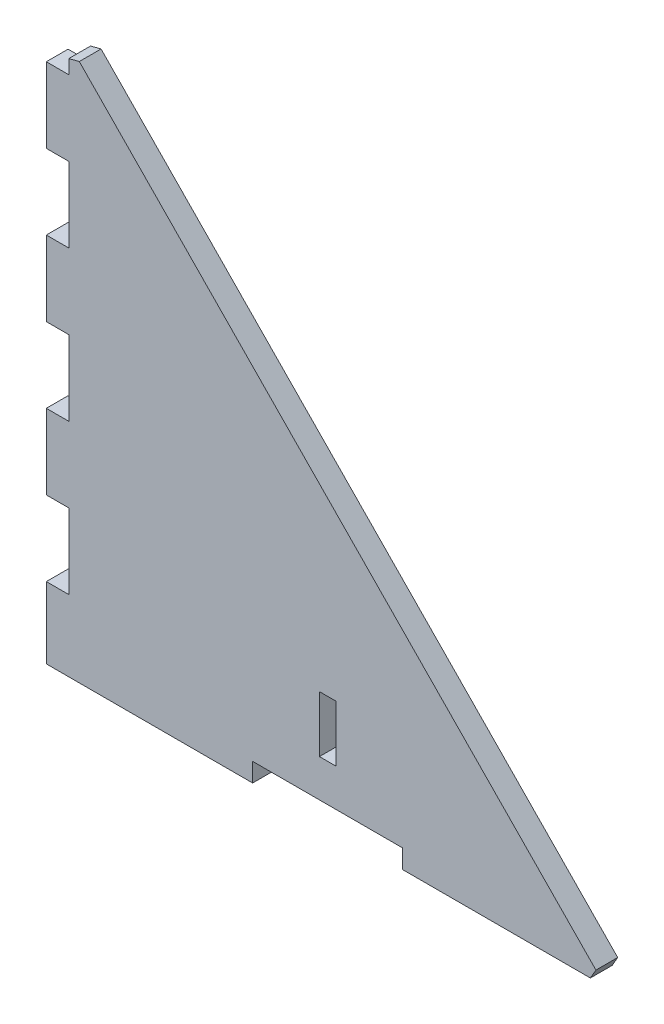
ISO-10303-21;
HEADER;
FILE_DESCRIPTION(('STEP AP214'),'2;1');
FILE_NAME('part.step','',(''),(''),'','','');
FILE_SCHEMA(('AUTOMOTIVE_DESIGN { 1 0 10303 214 1 1 1 1 }'));
ENDSEC;
DATA;
#1=APPLICATION_CONTEXT('core data for automotive mechanical design processes');
#2=APPLICATION_PROTOCOL_DEFINITION('international standard','automotive_design',2000,#1);
#3=PRODUCT_CONTEXT('',#1,'mechanical');
#4=PRODUCT('Part','Part','',(#3));
#5=PRODUCT_RELATED_PRODUCT_CATEGORY('part','',(#4));
#6=PRODUCT_DEFINITION_FORMATION('','',#4);
#7=PRODUCT_DEFINITION_CONTEXT('part definition',#1,'design');
#8=PRODUCT_DEFINITION('design','',#6,#7);
#9=PRODUCT_DEFINITION_SHAPE('','',#8);
#10=(LENGTH_UNIT() NAMED_UNIT(*) SI_UNIT(.MILLI.,.METRE.));
#11=(NAMED_UNIT(*) PLANE_ANGLE_UNIT() SI_UNIT($,.RADIAN.));
#12=(NAMED_UNIT(*) SI_UNIT($,.STERADIAN.) SOLID_ANGLE_UNIT());
#13=UNCERTAINTY_MEASURE_WITH_UNIT(LENGTH_MEASURE(1.E-05),#10,'distance_accuracy_value','');
#14=(GEOMETRIC_REPRESENTATION_CONTEXT(3) GLOBAL_UNCERTAINTY_ASSIGNED_CONTEXT((#13)) GLOBAL_UNIT_ASSIGNED_CONTEXT((#10,
#11,#12)) REPRESENTATION_CONTEXT('',''));
#15=CARTESIAN_POINT('',(0.,0.,0.));
#16=DIRECTION('',(0.,0.,1.));
#17=DIRECTION('',(1.,0.,0.));
#18=AXIS2_PLACEMENT_3D('',#15,#16,#17);
#19=CARTESIAN_POINT('',(0.,0.,84.8143550510485));
#20=DIRECTION('',(0.,0.,1.));
#21=DIRECTION('',(-1.,0.,0.));
#22=AXIS2_PLACEMENT_3D('',#19,#20,#21);
#23=PLANE('',#22);
#24=DIRECTION('',(0.699031413700107,-0.715090961109445,0.));
#25=VECTOR('',#24,1.);
#26=CARTESIAN_POINT('',(5.99999999999928,73.6541279702322,84.8143550510485));
#27=LINE('',#26,#25);
#28=CARTESIAN_POINT('',(7.39806282739952,72.2239460480133,84.8143550510485));
#29=VERTEX_POINT('',#28);
#30=CARTESIAN_POINT('',(76.2538531899955,1.78626278609469,84.8143550510485));
#31=VERTEX_POINT('',#30);
#32=EDGE_CURVE('E316',#29,#31,#27,.T.);
#33=ORIENTED_EDGE('',*,*,#32,.F.);
#34=DIRECTION('',(0.968802645187463,0.247833481752919,0.));
#35=VECTOR('',#34,1.);
#36=CARTESIAN_POINT('',(-16.8866949550152,66.011559960259,84.8143550510485));
#37=LINE('',#36,#35);
#38=CARTESIAN_POINT('',(5.99999999999921,71.8663017125595,84.8143550510485));
#39=VERTEX_POINT('',#38);
#40=EDGE_CURVE('E47',#29,#39,#37,.F.);
#41=ORIENTED_EDGE('',*,*,#40,.T.);
#42=DIRECTION('',(0.,1.,0.));
#43=VECTOR('',#42,1.);
#44=CARTESIAN_POINT('',(5.99999999999913,69.9999999999999,84.8143550510485));
#45=LINE('',#44,#43);
#46=CARTESIAN_POINT('',(5.99999999999913,69.9999999999999,84.8143550510485));
#47=VERTEX_POINT('',#46);
#48=EDGE_CURVE('E313',#47,#39,#45,.T.);
#49=ORIENTED_EDGE('',*,*,#48,.F.);
#50=DIRECTION('',(1.,0.,0.));
#51=VECTOR('',#50,1.);
#52=CARTESIAN_POINT('',(5.99999999999913,69.9999999999999,84.8143550510485));
#53=LINE('',#52,#51);
#54=CARTESIAN_POINT('',(2.99999999999914,69.9999999999999,84.8143550510485));
#55=VERTEX_POINT('',#54);
#56=EDGE_CURVE('E310',#55,#47,#53,.T.);
#57=ORIENTED_EDGE('',*,*,#56,.F.);
#58=DIRECTION('',(0.,1.,0.));
#59=VECTOR('',#58,1.);
#60=CARTESIAN_POINT('',(2.99999999999914,59.9999999999999,84.8143550510485));
#61=LINE('',#60,#59);
#62=CARTESIAN_POINT('',(2.99999999999914,59.9999999999999,84.8143550510485));
#63=VERTEX_POINT('',#62);
#64=EDGE_CURVE('E307',#63,#55,#61,.T.);
#65=ORIENTED_EDGE('',*,*,#64,.F.);
#66=DIRECTION('',(-1.,0.,0.));
#67=VECTOR('',#66,1.);
#68=CARTESIAN_POINT('',(5.99999999999913,59.9999999999999,84.8143550510485));
#69=LINE('',#68,#67);
#70=CARTESIAN_POINT('',(5.99999999999913,59.9999999999999,84.8143550510485));
#71=VERTEX_POINT('',#70);
#72=EDGE_CURVE('E304',#71,#63,#69,.T.);
#73=ORIENTED_EDGE('',*,*,#72,.F.);
#74=DIRECTION('',(0.,1.,0.));
#75=VECTOR('',#74,1.);
#76=CARTESIAN_POINT('',(5.99999999999913,49.9999999999999,84.8143550510485));
#77=LINE('',#76,#75);
#78=CARTESIAN_POINT('',(5.99999999999913,49.9999999999999,84.8143550510485));
#79=VERTEX_POINT('',#78);
#80=EDGE_CURVE('E301',#79,#71,#77,.T.);
#81=ORIENTED_EDGE('',*,*,#80,.F.);
#82=DIRECTION('',(1.,0.,0.));
#83=VECTOR('',#82,1.);
#84=CARTESIAN_POINT('',(5.99999999999913,49.9999999999999,84.8143550510485));
#85=LINE('',#84,#83);
#86=CARTESIAN_POINT('',(2.99999999999914,49.9999999999999,84.8143550510485));
#87=VERTEX_POINT('',#86);
#88=EDGE_CURVE('E298',#87,#79,#85,.T.);
#89=ORIENTED_EDGE('',*,*,#88,.F.);
#90=DIRECTION('',(0.,1.,0.));
#91=VECTOR('',#90,1.);
#92=CARTESIAN_POINT('',(2.99999999999914,39.9999999999999,84.8143550510485));
#93=LINE('',#92,#91);
#94=CARTESIAN_POINT('',(2.99999999999914,39.9999999999999,84.8143550510485));
#95=VERTEX_POINT('',#94);
#96=EDGE_CURVE('E295',#95,#87,#93,.T.);
#97=ORIENTED_EDGE('',*,*,#96,.F.);
#98=DIRECTION('',(-1.,0.,0.));
#99=VECTOR('',#98,1.);
#100=CARTESIAN_POINT('',(5.99999999999913,39.9999999999999,84.8143550510485));
#101=LINE('',#100,#99);
#102=CARTESIAN_POINT('',(5.99999999999913,39.9999999999999,84.8143550510485));
#103=VERTEX_POINT('',#102);
#104=EDGE_CURVE('E292',#103,#95,#101,.T.);
#105=ORIENTED_EDGE('',*,*,#104,.F.);
#106=DIRECTION('',(0.,1.,0.));
#107=VECTOR('',#106,1.);
#108=CARTESIAN_POINT('',(5.99999999999913,29.9999999999999,84.8143550510485));
#109=LINE('',#108,#107);
#110=CARTESIAN_POINT('',(5.99999999999913,29.9999999999999,84.8143550510485));
#111=VERTEX_POINT('',#110);
#112=EDGE_CURVE('E289',#111,#103,#109,.T.);
#113=ORIENTED_EDGE('',*,*,#112,.F.);
#114=DIRECTION('',(1.,0.,0.));
#115=VECTOR('',#114,1.);
#116=CARTESIAN_POINT('',(5.99999999999913,29.9999999999999,84.8143550510485));
#117=LINE('',#116,#115);
#118=CARTESIAN_POINT('',(2.99999999999913,29.9999999999998,84.8143550510485));
#119=VERTEX_POINT('',#118);
#120=EDGE_CURVE('E286',#119,#111,#117,.T.);
#121=ORIENTED_EDGE('',*,*,#120,.F.);
#122=DIRECTION('',(0.,1.,0.));
#123=VECTOR('',#122,1.);
#124=CARTESIAN_POINT('',(2.99999999999913,19.9999999999999,84.8143550510485));
#125=LINE('',#124,#123);
#126=CARTESIAN_POINT('',(2.99999999999913,19.9999999999999,84.8143550510485));
#127=VERTEX_POINT('',#126);
#128=EDGE_CURVE('E283',#127,#119,#125,.T.);
#129=ORIENTED_EDGE('',*,*,#128,.F.);
#130=DIRECTION('',(-1.,0.,0.));
#131=VECTOR('',#130,1.);
#132=CARTESIAN_POINT('',(5.99999999999927,19.9999999999998,84.8143550510485));
#133=LINE('',#132,#131);
#134=CARTESIAN_POINT('',(5.99999999999927,19.9999999999998,84.8143550510485));
#135=VERTEX_POINT('',#134);
#136=EDGE_CURVE('E280',#135,#127,#133,.T.);
#137=ORIENTED_EDGE('',*,*,#136,.F.);
#138=DIRECTION('',(0.,1.,0.));
#139=VECTOR('',#138,1.);
#140=CARTESIAN_POINT('',(5.9999999999992,9.99999999999984,84.8143550510485));
#141=LINE('',#140,#139);
#142=CARTESIAN_POINT('',(5.9999999999992,9.99999999999984,84.8143550510485));
#143=VERTEX_POINT('',#142);
#144=EDGE_CURVE('E277',#143,#135,#141,.T.);
#145=ORIENTED_EDGE('',*,*,#144,.F.);
#146=DIRECTION('',(1.,0.,0.));
#147=VECTOR('',#146,1.);
#148=CARTESIAN_POINT('',(5.9999999999992,9.99999999999984,84.8143550510485));
#149=LINE('',#148,#147);
#150=CARTESIAN_POINT('',(2.99999999999913,9.99999999999986,84.8143550510485));
#151=VERTEX_POINT('',#150);
#152=EDGE_CURVE('E274',#151,#143,#149,.T.);
#153=ORIENTED_EDGE('',*,*,#152,.F.);
#154=DIRECTION('',(0.,1.,0.));
#155=VECTOR('',#154,1.);
#156=CARTESIAN_POINT('',(2.99999999999912,0.,84.8143550510485));
#157=LINE('',#156,#155);
#158=CARTESIAN_POINT('',(2.99999999999913,0.5,84.8143550510485));
#159=VERTEX_POINT('',#158);
#160=EDGE_CURVE('E271',#159,#151,#157,.T.);
#161=ORIENTED_EDGE('',*,*,#160,.F.);
#162=DIRECTION('',(-1.,0.,0.));
#163=VECTOR('',#162,1.);
#164=CARTESIAN_POINT('',(0.,0.5,84.8143550510485));
#165=LINE('',#164,#163);
#166=CARTESIAN_POINT('',(30.4999999999991,0.5,84.8143550510485));
#167=VERTEX_POINT('',#166);
#168=EDGE_CURVE('E270',#167,#159,#165,.T.);
#169=ORIENTED_EDGE('',*,*,#168,.F.);
#170=DIRECTION('',(0.,-1.,0.));
#171=VECTOR('',#170,1.);
#172=CARTESIAN_POINT('',(30.4999999999991,0.,84.8143550510485));
#173=LINE('',#172,#171);
#174=CARTESIAN_POINT('',(30.4999999999991,3.,84.8143550510485));
#175=VERTEX_POINT('',#174);
#176=EDGE_CURVE('E267',#175,#167,#173,.T.);
#177=ORIENTED_EDGE('',*,*,#176,.F.);
#178=DIRECTION('',(-1.,0.,0.));
#179=VECTOR('',#178,1.);
#180=CARTESIAN_POINT('',(30.4999999999991,3.,84.8143550510485));
#181=LINE('',#180,#179);
#182=CARTESIAN_POINT('',(50.4999999999991,3.,84.8143550510485));
#183=VERTEX_POINT('',#182);
#184=EDGE_CURVE('E263',#183,#175,#181,.T.);
#185=ORIENTED_EDGE('',*,*,#184,.F.);
#186=DIRECTION('',(0.,1.,0.));
#187=VECTOR('',#186,1.);
#188=CARTESIAN_POINT('',(50.4999999999991,0.,84.8143550510485));
#189=LINE('',#188,#187);
#190=CARTESIAN_POINT('',(50.4999999999991,0.499999999999998,84.8143550510485));
#191=VERTEX_POINT('',#190);
#192=EDGE_CURVE('E260',#191,#183,#189,.T.);
#193=ORIENTED_EDGE('',*,*,#192,.F.);
#194=DIRECTION('',(-1.,0.,0.));
#195=VECTOR('',#194,1.);
#196=CARTESIAN_POINT('',(0.,0.500000000000004,84.8143550510485));
#197=LINE('',#196,#195);
#198=CARTESIAN_POINT('',(75.5112290241952,0.499999999999995,84.8143550510485));
#199=VERTEX_POINT('',#198);
#200=EDGE_CURVE('E264',#199,#191,#197,.T.);
#201=ORIENTED_EDGE('',*,*,#200,.F.);
#202=DIRECTION('',(-0.499999999999994,-0.866025403784442,0.));
#203=VECTOR('',#202,1.);
#204=CARTESIAN_POINT('',(56.4169154172007,-32.5723213029687,84.8143550510485));
#205=LINE('',#204,#203);
#206=EDGE_CURVE('E59',#199,#31,#205,.F.);
#207=ORIENTED_EDGE('',*,*,#206,.T.);
#208=EDGE_LOOP('',(#33,#41,#49,#57,#65,#73,#81,#89,#97,#105,#113,#121,#129,#137,#145,#153,#161,
#169,#177,#185,#193,#201,#207));
#209=FACE_BOUND('',#208,.T.);
#210=DIRECTION('',(0.,1.,0.));
#211=VECTOR('',#210,1.);
#212=CARTESIAN_POINT('',(39.3999999999991,8.,84.8143550510485));
#213=LINE('',#212,#211);
#214=CARTESIAN_POINT('',(39.3999999999991,8.,84.8143550510485));
#215=VERTEX_POINT('',#214);
#216=CARTESIAN_POINT('',(39.3999999999991,15.5,84.8143550510485));
#217=VERTEX_POINT('',#216);
#218=EDGE_CURVE('E235',#215,#217,#213,.T.);
#219=ORIENTED_EDGE('',*,*,#218,.T.);
#220=DIRECTION('',(1.,0.,0.));
#221=VECTOR('',#220,1.);
#222=CARTESIAN_POINT('',(39.3999999999991,15.5,84.8143550510485));
#223=LINE('',#222,#221);
#224=CARTESIAN_POINT('',(41.5999999999991,15.5,84.8143550510485));
#225=VERTEX_POINT('',#224);
#226=EDGE_CURVE('E242',#217,#225,#223,.T.);
#227=ORIENTED_EDGE('',*,*,#226,.T.);
#228=DIRECTION('',(0.,-1.,0.));
#229=VECTOR('',#228,1.);
#230=CARTESIAN_POINT('',(41.5999999999991,8.,84.8143550510485));
#231=LINE('',#230,#229);
#232=CARTESIAN_POINT('',(41.5999999999991,8.,84.8143550510485));
#233=VERTEX_POINT('',#232);
#234=EDGE_CURVE('E237',#225,#233,#231,.T.);
#235=ORIENTED_EDGE('',*,*,#234,.T.);
#236=DIRECTION('',(-1.,0.,0.));
#237=VECTOR('',#236,1.);
#238=CARTESIAN_POINT('',(39.3999999999991,8.,84.8143550510485));
#239=LINE('',#238,#237);
#240=EDGE_CURVE('E221',#233,#215,#239,.T.);
#241=ORIENTED_EDGE('',*,*,#240,.T.);
#242=EDGE_LOOP('',(#219,#227,#235,#241));
#243=FACE_BOUND('',#242,.T.);
#244=ADVANCED_FACE('F38',(#209,#243),#23,.T.);
#245=CARTESIAN_POINT('',(0.,0.,81.9143550510485));
#246=DIRECTION('',(0.,0.,1.));
#247=DIRECTION('',(-1.,0.,0.));
#248=AXIS2_PLACEMENT_3D('',#245,#246,#247);
#249=PLANE('',#248);
#250=DIRECTION('',(0.,1.,0.));
#251=VECTOR('',#250,1.);
#252=CARTESIAN_POINT('',(5.99999999999913,69.9999999999999,81.9143550510485));
#253=LINE('',#252,#251);
#254=CARTESIAN_POINT('',(5.99999999999913,69.9999999999999,81.9143550510485));
#255=VERTEX_POINT('',#254);
#256=CARTESIAN_POINT('',(5.99999999999921,71.8663017125595,81.9143550510485));
#257=VERTEX_POINT('',#256);
#258=EDGE_CURVE('E371',#255,#257,#253,.T.);
#259=ORIENTED_EDGE('',*,*,#258,.T.);
#260=DIRECTION('',(-0.968802645187463,-0.247833481752919,0.));
#261=VECTOR('',#260,1.);
#262=CARTESIAN_POINT('',(5.99999999999921,71.8663017125595,81.9143550510485));
#263=LINE('',#262,#261);
#264=CARTESIAN_POINT('',(7.39806282739951,72.2239460480133,81.9143550510485));
#265=VERTEX_POINT('',#264);
#266=EDGE_CURVE('E426',#257,#265,#263,.F.);
#267=ORIENTED_EDGE('',*,*,#266,.T.);
#268=DIRECTION('',(0.699031413700107,-0.715090961109445,0.));
#269=VECTOR('',#268,1.);
#270=CARTESIAN_POINT('',(5.99999999999928,73.6541279702322,81.9143550510485));
#271=LINE('',#270,#269);
#272=CARTESIAN_POINT('',(76.2538531899955,1.78626278609469,81.9143550510485));
#273=VERTEX_POINT('',#272);
#274=EDGE_CURVE('E374',#265,#273,#271,.T.);
#275=ORIENTED_EDGE('',*,*,#274,.T.);
#276=DIRECTION('',(0.499999999999994,0.866025403784442,0.));
#277=VECTOR('',#276,1.);
#278=CARTESIAN_POINT('',(76.2538531899955,1.78626278609469,81.9143550510485));
#279=LINE('',#278,#277);
#280=CARTESIAN_POINT('',(75.5112290241952,0.499999999999995,81.9143550510485));
#281=VERTEX_POINT('',#280);
#282=EDGE_CURVE('E424',#273,#281,#279,.F.);
#283=ORIENTED_EDGE('',*,*,#282,.T.);
#284=DIRECTION('',(-1.,0.,0.));
#285=VECTOR('',#284,1.);
#286=CARTESIAN_POINT('',(0.,0.500000000000004,81.9143550510485));
#287=LINE('',#286,#285);
#288=CARTESIAN_POINT('',(50.4999999999991,0.499999999999998,81.9143550510485));
#289=VERTEX_POINT('',#288);
#290=EDGE_CURVE('E229',#281,#289,#287,.T.);
#291=ORIENTED_EDGE('',*,*,#290,.T.);
#292=DIRECTION('',(0.,1.,0.));
#293=VECTOR('',#292,1.);
#294=CARTESIAN_POINT('',(50.4999999999991,0.,81.9143550510485));
#295=LINE('',#294,#293);
#296=CARTESIAN_POINT('',(50.4999999999991,3.,81.9143550510485));
#297=VERTEX_POINT('',#296);
#298=EDGE_CURVE('E319',#289,#297,#295,.T.);
#299=ORIENTED_EDGE('',*,*,#298,.T.);
#300=DIRECTION('',(-1.,0.,0.));
#301=VECTOR('',#300,1.);
#302=CARTESIAN_POINT('',(30.4999999999991,3.,81.9143550510485));
#303=LINE('',#302,#301);
#304=CARTESIAN_POINT('',(30.4999999999991,3.,81.9143550510485));
#305=VERTEX_POINT('',#304);
#306=EDGE_CURVE('E322',#297,#305,#303,.T.);
#307=ORIENTED_EDGE('',*,*,#306,.T.);
#308=DIRECTION('',(0.,-1.,0.));
#309=VECTOR('',#308,1.);
#310=CARTESIAN_POINT('',(30.4999999999991,0.,81.9143550510485));
#311=LINE('',#310,#309);
#312=CARTESIAN_POINT('',(30.4999999999991,0.5,81.9143550510485));
#313=VERTEX_POINT('',#312);
#314=EDGE_CURVE('E325',#305,#313,#311,.T.);
#315=ORIENTED_EDGE('',*,*,#314,.T.);
#316=DIRECTION('',(-1.,0.,0.));
#317=VECTOR('',#316,1.);
#318=CARTESIAN_POINT('',(0.,0.5,81.9143550510485));
#319=LINE('',#318,#317);
#320=CARTESIAN_POINT('',(2.99999999999912,0.5,81.9143550510485));
#321=VERTEX_POINT('',#320);
#322=EDGE_CURVE('E328',#313,#321,#319,.T.);
#323=ORIENTED_EDGE('',*,*,#322,.T.);
#324=DIRECTION('',(0.,1.,0.));
#325=VECTOR('',#324,1.);
#326=CARTESIAN_POINT('',(2.99999999999912,0.,81.9143550510485));
#327=LINE('',#326,#325);
#328=CARTESIAN_POINT('',(2.99999999999913,9.99999999999986,81.9143550510485));
#329=VERTEX_POINT('',#328);
#330=EDGE_CURVE('E329',#321,#329,#327,.T.);
#331=ORIENTED_EDGE('',*,*,#330,.T.);
#332=DIRECTION('',(1.,0.,0.));
#333=VECTOR('',#332,1.);
#334=CARTESIAN_POINT('',(5.9999999999992,9.99999999999984,81.9143550510485));
#335=LINE('',#334,#333);
#336=CARTESIAN_POINT('',(5.9999999999992,9.99999999999984,81.9143550510485));
#337=VERTEX_POINT('',#336);
#338=EDGE_CURVE('E332',#329,#337,#335,.T.);
#339=ORIENTED_EDGE('',*,*,#338,.T.);
#340=DIRECTION('',(0.,1.,0.));
#341=VECTOR('',#340,1.);
#342=CARTESIAN_POINT('',(5.9999999999992,9.99999999999984,81.9143550510485));
#343=LINE('',#342,#341);
#344=CARTESIAN_POINT('',(5.99999999999927,19.9999999999998,81.9143550510485));
#345=VERTEX_POINT('',#344);
#346=EDGE_CURVE('E335',#337,#345,#343,.T.);
#347=ORIENTED_EDGE('',*,*,#346,.T.);
#348=DIRECTION('',(-1.,0.,0.));
#349=VECTOR('',#348,1.);
#350=CARTESIAN_POINT('',(5.99999999999927,19.9999999999998,81.9143550510485));
#351=LINE('',#350,#349);
#352=CARTESIAN_POINT('',(2.99999999999913,19.9999999999999,81.9143550510485));
#353=VERTEX_POINT('',#352);
#354=EDGE_CURVE('E338',#345,#353,#351,.T.);
#355=ORIENTED_EDGE('',*,*,#354,.T.);
#356=DIRECTION('',(0.,1.,0.));
#357=VECTOR('',#356,1.);
#358=CARTESIAN_POINT('',(2.99999999999913,19.9999999999999,81.9143550510485));
#359=LINE('',#358,#357);
#360=CARTESIAN_POINT('',(2.99999999999913,29.9999999999998,81.9143550510485));
#361=VERTEX_POINT('',#360);
#362=EDGE_CURVE('E341',#353,#361,#359,.T.);
#363=ORIENTED_EDGE('',*,*,#362,.T.);
#364=DIRECTION('',(1.,0.,0.));
#365=VECTOR('',#364,1.);
#366=CARTESIAN_POINT('',(5.99999999999913,29.9999999999999,81.9143550510485));
#367=LINE('',#366,#365);
#368=CARTESIAN_POINT('',(5.99999999999913,29.9999999999999,81.9143550510485));
#369=VERTEX_POINT('',#368);
#370=EDGE_CURVE('E344',#361,#369,#367,.T.);
#371=ORIENTED_EDGE('',*,*,#370,.T.);
#372=DIRECTION('',(0.,1.,0.));
#373=VECTOR('',#372,1.);
#374=CARTESIAN_POINT('',(5.99999999999913,29.9999999999999,81.9143550510485));
#375=LINE('',#374,#373);
#376=CARTESIAN_POINT('',(5.99999999999913,39.9999999999999,81.9143550510485));
#377=VERTEX_POINT('',#376);
#378=EDGE_CURVE('E347',#369,#377,#375,.T.);
#379=ORIENTED_EDGE('',*,*,#378,.T.);
#380=DIRECTION('',(-1.,0.,0.));
#381=VECTOR('',#380,1.);
#382=CARTESIAN_POINT('',(5.99999999999913,39.9999999999999,81.9143550510485));
#383=LINE('',#382,#381);
#384=CARTESIAN_POINT('',(2.99999999999913,39.9999999999999,81.9143550510485));
#385=VERTEX_POINT('',#384);
#386=EDGE_CURVE('E350',#377,#385,#383,.T.);
#387=ORIENTED_EDGE('',*,*,#386,.T.);
#388=DIRECTION('',(0.,1.,0.));
#389=VECTOR('',#388,1.);
#390=CARTESIAN_POINT('',(2.99999999999913,39.9999999999999,81.9143550510485));
#391=LINE('',#390,#389);
#392=CARTESIAN_POINT('',(2.99999999999914,49.9999999999999,81.9143550510485));
#393=VERTEX_POINT('',#392);
#394=EDGE_CURVE('E353',#385,#393,#391,.T.);
#395=ORIENTED_EDGE('',*,*,#394,.T.);
#396=DIRECTION('',(1.,0.,0.));
#397=VECTOR('',#396,1.);
#398=CARTESIAN_POINT('',(5.99999999999913,49.9999999999999,81.9143550510485));
#399=LINE('',#398,#397);
#400=CARTESIAN_POINT('',(5.99999999999913,49.9999999999999,81.9143550510485));
#401=VERTEX_POINT('',#400);
#402=EDGE_CURVE('E356',#393,#401,#399,.T.);
#403=ORIENTED_EDGE('',*,*,#402,.T.);
#404=DIRECTION('',(0.,1.,0.));
#405=VECTOR('',#404,1.);
#406=CARTESIAN_POINT('',(5.99999999999913,49.9999999999999,81.9143550510485));
#407=LINE('',#406,#405);
#408=CARTESIAN_POINT('',(5.99999999999913,59.9999999999999,81.9143550510485));
#409=VERTEX_POINT('',#408);
#410=EDGE_CURVE('E359',#401,#409,#407,.T.);
#411=ORIENTED_EDGE('',*,*,#410,.T.);
#412=DIRECTION('',(-1.,0.,0.));
#413=VECTOR('',#412,1.);
#414=CARTESIAN_POINT('',(5.99999999999913,59.9999999999999,81.9143550510485));
#415=LINE('',#414,#413);
#416=CARTESIAN_POINT('',(2.99999999999914,59.9999999999999,81.9143550510485));
#417=VERTEX_POINT('',#416);
#418=EDGE_CURVE('E362',#409,#417,#415,.T.);
#419=ORIENTED_EDGE('',*,*,#418,.T.);
#420=DIRECTION('',(0.,1.,0.));
#421=VECTOR('',#420,1.);
#422=CARTESIAN_POINT('',(2.99999999999914,59.9999999999999,81.9143550510485));
#423=LINE('',#422,#421);
#424=CARTESIAN_POINT('',(2.99999999999914,69.9999999999999,81.9143550510485));
#425=VERTEX_POINT('',#424);
#426=EDGE_CURVE('E365',#417,#425,#423,.T.);
#427=ORIENTED_EDGE('',*,*,#426,.T.);
#428=DIRECTION('',(1.,0.,0.));
#429=VECTOR('',#428,1.);
#430=CARTESIAN_POINT('',(5.99999999999913,69.9999999999999,81.9143550510485));
#431=LINE('',#430,#429);
#432=EDGE_CURVE('E368',#425,#255,#431,.T.);
#433=ORIENTED_EDGE('',*,*,#432,.T.);
#434=EDGE_LOOP('',(#259,#267,#275,#283,#291,#299,#307,#315,#323,#331,#339,#347,#355,#363,#371,
#379,#387,#395,#403,#411,#419,#427,#433));
#435=FACE_BOUND('',#434,.T.);
#436=DIRECTION('',(-1.,0.,0.));
#437=VECTOR('',#436,1.);
#438=CARTESIAN_POINT('',(39.3999999999991,8.,81.9143550510485));
#439=LINE('',#438,#437);
#440=CARTESIAN_POINT('',(41.5999999999991,8.,81.9143550510485));
#441=VERTEX_POINT('',#440);
#442=CARTESIAN_POINT('',(39.3999999999991,8.,81.9143550510485));
#443=VERTEX_POINT('',#442);
#444=EDGE_CURVE('E224',#441,#443,#439,.T.);
#445=ORIENTED_EDGE('',*,*,#444,.F.);
#446=DIRECTION('',(0.,-1.,0.));
#447=VECTOR('',#446,1.);
#448=CARTESIAN_POINT('',(41.5999999999991,8.,81.9143550510485));
#449=LINE('',#448,#447);
#450=CARTESIAN_POINT('',(41.5999999999991,15.5,81.9143550510485));
#451=VERTEX_POINT('',#450);
#452=EDGE_CURVE('E238',#451,#441,#449,.T.);
#453=ORIENTED_EDGE('',*,*,#452,.F.);
#454=DIRECTION('',(1.,0.,0.));
#455=VECTOR('',#454,1.);
#456=CARTESIAN_POINT('',(39.3999999999991,15.5,81.9143550510485));
#457=LINE('',#456,#455);
#458=CARTESIAN_POINT('',(39.3999999999991,15.5,81.9143550510485));
#459=VERTEX_POINT('',#458);
#460=EDGE_CURVE('E251',#459,#451,#457,.T.);
#461=ORIENTED_EDGE('',*,*,#460,.F.);
#462=DIRECTION('',(0.,1.,0.));
#463=VECTOR('',#462,1.);
#464=CARTESIAN_POINT('',(39.3999999999991,8.,81.9143550510485));
#465=LINE('',#464,#463);
#466=EDGE_CURVE('E249',#443,#459,#465,.T.);
#467=ORIENTED_EDGE('',*,*,#466,.F.);
#468=EDGE_LOOP('',(#445,#453,#461,#467));
#469=FACE_BOUND('',#468,.T.);
#470=ADVANCED_FACE('F445',(#435,#469),#249,.F.);
#471=CARTESIAN_POINT('',(77.9999999999991,0.499999999999994,84.8143550510485));
#472=DIRECTION('',(0.,1.,0.));
#473=DIRECTION('',(-1.,0.,0.));
#474=AXIS2_PLACEMENT_3D('',#471,#472,#473);
#475=PLANE('',#474);
#476=ORIENTED_EDGE('',*,*,#290,.F.);
#477=DIRECTION('',(0.,0.,1.));
#478=VECTOR('',#477,1.);
#479=CARTESIAN_POINT('',(75.5112290241952,0.499999999999995,84.8143550510485));
#480=LINE('',#479,#478);
#481=EDGE_CURVE('E12',#281,#199,#480,.T.);
#482=ORIENTED_EDGE('',*,*,#481,.T.);
#483=ORIENTED_EDGE('',*,*,#200,.T.);
#484=DIRECTION('',(0.,0.,-1.));
#485=VECTOR('',#484,1.);
#486=CARTESIAN_POINT('',(50.4999999999991,0.499999999999998,84.8143550510485));
#487=LINE('',#486,#485);
#488=EDGE_CURVE('E410',#191,#289,#487,.T.);
#489=ORIENTED_EDGE('',*,*,#488,.T.);
#490=EDGE_LOOP('',(#476,#482,#483,#489));
#491=FACE_BOUND('',#490,.T.);
#492=ADVANCED_FACE('F451',(#491),#475,.F.);
#493=CARTESIAN_POINT('',(50.4999999999991,0.,84.8143550510485));
#494=DIRECTION('',(1.,0.,0.));
#495=DIRECTION('',(0.,0.,1.));
#496=AXIS2_PLACEMENT_3D('',#493,#494,#495);
#497=PLANE('',#496);
#498=ORIENTED_EDGE('',*,*,#298,.F.);
#499=ORIENTED_EDGE('',*,*,#488,.F.);
#500=ORIENTED_EDGE('',*,*,#192,.T.);
#501=DIRECTION('',(0.,0.,-1.));
#502=VECTOR('',#501,1.);
#503=CARTESIAN_POINT('',(50.4999999999991,3.,84.8143550510485));
#504=LINE('',#503,#502);
#505=EDGE_CURVE('E407',#183,#297,#504,.T.);
#506=ORIENTED_EDGE('',*,*,#505,.T.);
#507=EDGE_LOOP('',(#498,#499,#500,#506));
#508=FACE_BOUND('',#507,.T.);
#509=ADVANCED_FACE('F456',(#508),#497,.F.);
#510=CARTESIAN_POINT('',(30.4999999999991,3.,84.8143550510485));
#511=DIRECTION('',(0.,1.,0.));
#512=DIRECTION('',(-1.,0.,0.));
#513=AXIS2_PLACEMENT_3D('',#510,#511,#512);
#514=PLANE('',#513);
#515=ORIENTED_EDGE('',*,*,#306,.F.);
#516=ORIENTED_EDGE('',*,*,#505,.F.);
#517=ORIENTED_EDGE('',*,*,#184,.T.);
#518=DIRECTION('',(0.,0.,-1.));
#519=VECTOR('',#518,1.);
#520=CARTESIAN_POINT('',(30.4999999999991,3.,84.8143550510485));
#521=LINE('',#520,#519);
#522=EDGE_CURVE('E405',#175,#305,#521,.T.);
#523=ORIENTED_EDGE('',*,*,#522,.T.);
#524=EDGE_LOOP('',(#515,#516,#517,#523));
#525=FACE_BOUND('',#524,.T.);
#526=ADVANCED_FACE('F460',(#525),#514,.F.);
#527=CARTESIAN_POINT('',(30.4999999999991,0.,84.8143550510485));
#528=DIRECTION('',(-1.,0.,0.));
#529=DIRECTION('',(0.,-1.,0.));
#530=AXIS2_PLACEMENT_3D('',#527,#528,#529);
#531=PLANE('',#530);
#532=ORIENTED_EDGE('',*,*,#314,.F.);
#533=ORIENTED_EDGE('',*,*,#522,.F.);
#534=ORIENTED_EDGE('',*,*,#176,.T.);
#535=DIRECTION('',(0.,0.,-1.));
#536=VECTOR('',#535,1.);
#537=CARTESIAN_POINT('',(30.4999999999991,0.5,84.8143550510485));
#538=LINE('',#537,#536);
#539=EDGE_CURVE('E408',#167,#313,#538,.T.);
#540=ORIENTED_EDGE('',*,*,#539,.T.);
#541=EDGE_LOOP('',(#532,#533,#534,#540));
#542=FACE_BOUND('',#541,.T.);
#543=ADVANCED_FACE('F464',(#542),#531,.F.);
#544=CARTESIAN_POINT('',(30.4999999999991,0.5,84.8143550510485));
#545=DIRECTION('',(0.,1.,0.));
#546=DIRECTION('',(-1.,0.,0.));
#547=AXIS2_PLACEMENT_3D('',#544,#545,#546);
#548=PLANE('',#547);
#549=ORIENTED_EDGE('',*,*,#322,.F.);
#550=ORIENTED_EDGE('',*,*,#539,.F.);
#551=ORIENTED_EDGE('',*,*,#168,.T.);
#552=DIRECTION('',(0.,0.,-1.));
#553=VECTOR('',#552,1.);
#554=CARTESIAN_POINT('',(2.99999999999912,0.5,84.8143550510485));
#555=LINE('',#554,#553);
#556=EDGE_CURVE('E404',#159,#321,#555,.T.);
#557=ORIENTED_EDGE('',*,*,#556,.T.);
#558=EDGE_LOOP('',(#549,#550,#551,#557));
#559=FACE_BOUND('',#558,.T.);
#560=ADVANCED_FACE('F468',(#559),#548,.F.);
#561=CARTESIAN_POINT('',(2.99999999999912,0.,84.8143550510485));
#562=DIRECTION('',(1.,0.,0.));
#563=DIRECTION('',(0.,1.,0.));
#564=AXIS2_PLACEMENT_3D('',#561,#562,#563);
#565=PLANE('',#564);
#566=ORIENTED_EDGE('',*,*,#330,.F.);
#567=ORIENTED_EDGE('',*,*,#556,.F.);
#568=ORIENTED_EDGE('',*,*,#160,.T.);
#569=DIRECTION('',(0.,0.,-1.));
#570=VECTOR('',#569,1.);
#571=CARTESIAN_POINT('',(2.99999999999913,9.99999999999986,84.8143550510485));
#572=LINE('',#571,#570);
#573=EDGE_CURVE('E402',#151,#329,#572,.T.);
#574=ORIENTED_EDGE('',*,*,#573,.T.);
#575=EDGE_LOOP('',(#566,#567,#568,#574));
#576=FACE_BOUND('',#575,.T.);
#577=ADVANCED_FACE('F472',(#576),#565,.F.);
#578=CARTESIAN_POINT('',(5.9999999999992,9.99999999999984,84.8143550510485));
#579=DIRECTION('',(0.,-1.,0.));
#580=DIRECTION('',(1.,0.,0.));
#581=AXIS2_PLACEMENT_3D('',#578,#579,#580);
#582=PLANE('',#581);
#583=ORIENTED_EDGE('',*,*,#338,.F.);
#584=ORIENTED_EDGE('',*,*,#573,.F.);
#585=ORIENTED_EDGE('',*,*,#152,.T.);
#586=DIRECTION('',(0.,0.,-1.));
#587=VECTOR('',#586,1.);
#588=CARTESIAN_POINT('',(5.9999999999992,9.99999999999984,84.8143550510485));
#589=LINE('',#588,#587);
#590=EDGE_CURVE('E400',#143,#337,#589,.T.);
#591=ORIENTED_EDGE('',*,*,#590,.T.);
#592=EDGE_LOOP('',(#583,#584,#585,#591));
#593=FACE_BOUND('',#592,.T.);
#594=ADVANCED_FACE('F476',(#593),#582,.F.);
#595=CARTESIAN_POINT('',(5.9999999999992,9.99999999999984,84.8143550510485));
#596=DIRECTION('',(1.,0.,0.));
#597=DIRECTION('',(0.,1.,0.));
#598=AXIS2_PLACEMENT_3D('',#595,#596,#597);
#599=PLANE('',#598);
#600=ORIENTED_EDGE('',*,*,#346,.F.);
#601=ORIENTED_EDGE('',*,*,#590,.F.);
#602=ORIENTED_EDGE('',*,*,#144,.T.);
#603=DIRECTION('',(0.,0.,-1.));
#604=VECTOR('',#603,1.);
#605=CARTESIAN_POINT('',(5.99999999999927,19.9999999999998,84.8143550510485));
#606=LINE('',#605,#604);
#607=EDGE_CURVE('E398',#135,#345,#606,.T.);
#608=ORIENTED_EDGE('',*,*,#607,.T.);
#609=EDGE_LOOP('',(#600,#601,#602,#608));
#610=FACE_BOUND('',#609,.T.);
#611=ADVANCED_FACE('F480',(#610),#599,.F.);
#612=CARTESIAN_POINT('',(5.99999999999927,19.9999999999998,84.8143550510485));
#613=DIRECTION('',(0.,1.,0.));
#614=DIRECTION('',(-1.,0.,0.));
#615=AXIS2_PLACEMENT_3D('',#612,#613,#614);
#616=PLANE('',#615);
#617=ORIENTED_EDGE('',*,*,#354,.F.);
#618=ORIENTED_EDGE('',*,*,#607,.F.);
#619=ORIENTED_EDGE('',*,*,#136,.T.);
#620=DIRECTION('',(0.,0.,-1.));
#621=VECTOR('',#620,1.);
#622=CARTESIAN_POINT('',(2.99999999999913,19.9999999999999,84.8143550510485));
#623=LINE('',#622,#621);
#624=EDGE_CURVE('E396',#127,#353,#623,.T.);
#625=ORIENTED_EDGE('',*,*,#624,.T.);
#626=EDGE_LOOP('',(#617,#618,#619,#625));
#627=FACE_BOUND('',#626,.T.);
#628=ADVANCED_FACE('F484',(#627),#616,.F.);
#629=CARTESIAN_POINT('',(2.99999999999913,19.9999999999999,84.8143550510485));
#630=DIRECTION('',(1.,0.,0.));
#631=DIRECTION('',(0.,1.,0.));
#632=AXIS2_PLACEMENT_3D('',#629,#630,#631);
#633=PLANE('',#632);
#634=ORIENTED_EDGE('',*,*,#362,.F.);
#635=ORIENTED_EDGE('',*,*,#624,.F.);
#636=ORIENTED_EDGE('',*,*,#128,.T.);
#637=DIRECTION('',(0.,0.,-1.));
#638=VECTOR('',#637,1.);
#639=CARTESIAN_POINT('',(2.99999999999913,29.9999999999998,84.8143550510485));
#640=LINE('',#639,#638);
#641=EDGE_CURVE('E394',#119,#361,#640,.T.);
#642=ORIENTED_EDGE('',*,*,#641,.T.);
#643=EDGE_LOOP('',(#634,#635,#636,#642));
#644=FACE_BOUND('',#643,.T.);
#645=ADVANCED_FACE('F488',(#644),#633,.F.);
#646=CARTESIAN_POINT('',(5.99999999999913,29.9999999999999,84.8143550510485));
#647=DIRECTION('',(0.,-1.,0.));
#648=DIRECTION('',(1.,0.,0.));
#649=AXIS2_PLACEMENT_3D('',#646,#647,#648);
#650=PLANE('',#649);
#651=ORIENTED_EDGE('',*,*,#370,.F.);
#652=ORIENTED_EDGE('',*,*,#641,.F.);
#653=ORIENTED_EDGE('',*,*,#120,.T.);
#654=DIRECTION('',(0.,0.,-1.));
#655=VECTOR('',#654,1.);
#656=CARTESIAN_POINT('',(5.99999999999913,29.9999999999999,84.8143550510485));
#657=LINE('',#656,#655);
#658=EDGE_CURVE('E392',#111,#369,#657,.T.);
#659=ORIENTED_EDGE('',*,*,#658,.T.);
#660=EDGE_LOOP('',(#651,#652,#653,#659));
#661=FACE_BOUND('',#660,.T.);
#662=ADVANCED_FACE('F492',(#661),#650,.F.);
#663=CARTESIAN_POINT('',(5.99999999999913,29.9999999999999,84.8143550510485));
#664=DIRECTION('',(1.,0.,0.));
#665=DIRECTION('',(0.,0.,1.));
#666=AXIS2_PLACEMENT_3D('',#663,#664,#665);
#667=PLANE('',#666);
#668=ORIENTED_EDGE('',*,*,#378,.F.);
#669=ORIENTED_EDGE('',*,*,#658,.F.);
#670=ORIENTED_EDGE('',*,*,#112,.T.);
#671=DIRECTION('',(0.,0.,-1.));
#672=VECTOR('',#671,1.);
#673=CARTESIAN_POINT('',(5.99999999999913,39.9999999999999,84.8143550510485));
#674=LINE('',#673,#672);
#675=EDGE_CURVE('E390',#103,#377,#674,.T.);
#676=ORIENTED_EDGE('',*,*,#675,.T.);
#677=EDGE_LOOP('',(#668,#669,#670,#676));
#678=FACE_BOUND('',#677,.T.);
#679=ADVANCED_FACE('F496',(#678),#667,.F.);
#680=CARTESIAN_POINT('',(5.99999999999913,39.9999999999999,84.8143550510485));
#681=DIRECTION('',(0.,1.,0.));
#682=DIRECTION('',(-1.,0.,0.));
#683=AXIS2_PLACEMENT_3D('',#680,#681,#682);
#684=PLANE('',#683);
#685=ORIENTED_EDGE('',*,*,#386,.F.);
#686=ORIENTED_EDGE('',*,*,#675,.F.);
#687=ORIENTED_EDGE('',*,*,#104,.T.);
#688=DIRECTION('',(0.,0.,-1.));
#689=VECTOR('',#688,1.);
#690=CARTESIAN_POINT('',(2.99999999999914,39.9999999999999,84.8143550510485));
#691=LINE('',#690,#689);
#692=EDGE_CURVE('E388',#95,#385,#691,.T.);
#693=ORIENTED_EDGE('',*,*,#692,.T.);
#694=EDGE_LOOP('',(#685,#686,#687,#693));
#695=FACE_BOUND('',#694,.T.);
#696=ADVANCED_FACE('F500',(#695),#684,.F.);
#697=CARTESIAN_POINT('',(2.99999999999914,39.9999999999999,84.8143550510485));
#698=DIRECTION('',(1.,0.,0.));
#699=DIRECTION('',(0.,1.,0.));
#700=AXIS2_PLACEMENT_3D('',#697,#698,#699);
#701=PLANE('',#700);
#702=ORIENTED_EDGE('',*,*,#394,.F.);
#703=ORIENTED_EDGE('',*,*,#692,.F.);
#704=ORIENTED_EDGE('',*,*,#96,.T.);
#705=DIRECTION('',(0.,0.,-1.));
#706=VECTOR('',#705,1.);
#707=CARTESIAN_POINT('',(2.99999999999914,49.9999999999999,84.8143550510485));
#708=LINE('',#707,#706);
#709=EDGE_CURVE('E386',#87,#393,#708,.T.);
#710=ORIENTED_EDGE('',*,*,#709,.T.);
#711=EDGE_LOOP('',(#702,#703,#704,#710));
#712=FACE_BOUND('',#711,.T.);
#713=ADVANCED_FACE('F504',(#712),#701,.F.);
#714=CARTESIAN_POINT('',(5.99999999999913,49.9999999999999,84.8143550510485));
#715=DIRECTION('',(0.,-1.,0.));
#716=DIRECTION('',(1.,0.,0.));
#717=AXIS2_PLACEMENT_3D('',#714,#715,#716);
#718=PLANE('',#717);
#719=ORIENTED_EDGE('',*,*,#402,.F.);
#720=ORIENTED_EDGE('',*,*,#709,.F.);
#721=ORIENTED_EDGE('',*,*,#88,.T.);
#722=DIRECTION('',(0.,0.,-1.));
#723=VECTOR('',#722,1.);
#724=CARTESIAN_POINT('',(5.99999999999913,49.9999999999999,84.8143550510485));
#725=LINE('',#724,#723);
#726=EDGE_CURVE('E384',#79,#401,#725,.T.);
#727=ORIENTED_EDGE('',*,*,#726,.T.);
#728=EDGE_LOOP('',(#719,#720,#721,#727));
#729=FACE_BOUND('',#728,.T.);
#730=ADVANCED_FACE('F508',(#729),#718,.F.);
#731=CARTESIAN_POINT('',(5.99999999999913,49.9999999999999,84.8143550510485));
#732=DIRECTION('',(1.,0.,0.));
#733=DIRECTION('',(0.,0.,1.));
#734=AXIS2_PLACEMENT_3D('',#731,#732,#733);
#735=PLANE('',#734);
#736=ORIENTED_EDGE('',*,*,#410,.F.);
#737=ORIENTED_EDGE('',*,*,#726,.F.);
#738=ORIENTED_EDGE('',*,*,#80,.T.);
#739=DIRECTION('',(0.,0.,-1.));
#740=VECTOR('',#739,1.);
#741=CARTESIAN_POINT('',(5.99999999999913,59.9999999999999,84.8143550510485));
#742=LINE('',#741,#740);
#743=EDGE_CURVE('E382',#71,#409,#742,.T.);
#744=ORIENTED_EDGE('',*,*,#743,.T.);
#745=EDGE_LOOP('',(#736,#737,#738,#744));
#746=FACE_BOUND('',#745,.T.);
#747=ADVANCED_FACE('F512',(#746),#735,.F.);
#748=CARTESIAN_POINT('',(5.99999999999913,59.9999999999999,84.8143550510485));
#749=DIRECTION('',(0.,1.,0.));
#750=DIRECTION('',(-1.,0.,0.));
#751=AXIS2_PLACEMENT_3D('',#748,#749,#750);
#752=PLANE('',#751);
#753=ORIENTED_EDGE('',*,*,#418,.F.);
#754=ORIENTED_EDGE('',*,*,#743,.F.);
#755=ORIENTED_EDGE('',*,*,#72,.T.);
#756=DIRECTION('',(0.,0.,-1.));
#757=VECTOR('',#756,1.);
#758=CARTESIAN_POINT('',(2.99999999999914,59.9999999999999,84.8143550510485));
#759=LINE('',#758,#757);
#760=EDGE_CURVE('E380',#63,#417,#759,.T.);
#761=ORIENTED_EDGE('',*,*,#760,.T.);
#762=EDGE_LOOP('',(#753,#754,#755,#761));
#763=FACE_BOUND('',#762,.T.);
#764=ADVANCED_FACE('F516',(#763),#752,.F.);
#765=CARTESIAN_POINT('',(2.99999999999914,59.9999999999999,84.8143550510485));
#766=DIRECTION('',(1.,0.,0.));
#767=DIRECTION('',(0.,1.,0.));
#768=AXIS2_PLACEMENT_3D('',#765,#766,#767);
#769=PLANE('',#768);
#770=ORIENTED_EDGE('',*,*,#426,.F.);
#771=ORIENTED_EDGE('',*,*,#760,.F.);
#772=ORIENTED_EDGE('',*,*,#64,.T.);
#773=DIRECTION('',(0.,0.,-1.));
#774=VECTOR('',#773,1.);
#775=CARTESIAN_POINT('',(2.99999999999914,69.9999999999999,84.8143550510485));
#776=LINE('',#775,#774);
#777=EDGE_CURVE('E378',#55,#425,#776,.T.);
#778=ORIENTED_EDGE('',*,*,#777,.T.);
#779=EDGE_LOOP('',(#770,#771,#772,#778));
#780=FACE_BOUND('',#779,.T.);
#781=ADVANCED_FACE('F520',(#780),#769,.F.);
#782=CARTESIAN_POINT('',(5.99999999999913,69.9999999999999,84.8143550510485));
#783=DIRECTION('',(0.,-1.,0.));
#784=DIRECTION('',(1.,0.,0.));
#785=AXIS2_PLACEMENT_3D('',#782,#783,#784);
#786=PLANE('',#785);
#787=ORIENTED_EDGE('',*,*,#432,.F.);
#788=ORIENTED_EDGE('',*,*,#777,.F.);
#789=ORIENTED_EDGE('',*,*,#56,.T.);
#790=DIRECTION('',(0.,0.,-1.));
#791=VECTOR('',#790,1.);
#792=CARTESIAN_POINT('',(5.99999999999913,69.9999999999999,84.8143550510485));
#793=LINE('',#792,#791);
#794=EDGE_CURVE('E318',#47,#255,#793,.T.);
#795=ORIENTED_EDGE('',*,*,#794,.T.);
#796=EDGE_LOOP('',(#787,#788,#789,#795));
#797=FACE_BOUND('',#796,.T.);
#798=ADVANCED_FACE('F523',(#797),#786,.F.);
#799=CARTESIAN_POINT('',(5.99999999999913,69.9999999999999,84.8143550510485));
#800=DIRECTION('',(1.,0.,0.));
#801=DIRECTION('',(0.,1.,0.));
#802=AXIS2_PLACEMENT_3D('',#799,#800,#801);
#803=PLANE('',#802);
#804=ORIENTED_EDGE('',*,*,#48,.T.);
#805=DIRECTION('',(0.,0.,-1.));
#806=VECTOR('',#805,1.);
#807=CARTESIAN_POINT('',(5.99999999999921,71.8663017125595,84.8143550510485));
#808=LINE('',#807,#806);
#809=EDGE_CURVE('E420',#39,#257,#808,.T.);
#810=ORIENTED_EDGE('',*,*,#809,.T.);
#811=ORIENTED_EDGE('',*,*,#258,.F.);
#812=ORIENTED_EDGE('',*,*,#794,.F.);
#813=EDGE_LOOP('',(#804,#810,#811,#812));
#814=FACE_BOUND('',#813,.T.);
#815=ADVANCED_FACE('F440',(#814),#803,.F.);
#816=CARTESIAN_POINT('',(5.99999999999928,73.6541279702322,84.8143550510485));
#817=DIRECTION('',(-0.715090961109445,-0.699031413700107,0.));
#818=DIRECTION('',(0.699031413700107,-0.715090961109445,0.));
#819=AXIS2_PLACEMENT_3D('',#816,#817,#818);
#820=PLANE('',#819);
#821=ORIENTED_EDGE('',*,*,#274,.F.);
#822=DIRECTION('',(0.,0.,1.));
#823=VECTOR('',#822,1.);
#824=CARTESIAN_POINT('',(7.39806282739952,72.2239460480133,84.8143550510485));
#825=LINE('',#824,#823);
#826=EDGE_CURVE('E431',#265,#29,#825,.T.);
#827=ORIENTED_EDGE('',*,*,#826,.T.);
#828=ORIENTED_EDGE('',*,*,#32,.T.);
#829=DIRECTION('',(0.,0.,-1.));
#830=VECTOR('',#829,1.);
#831=CARTESIAN_POINT('',(76.2538531899955,1.78626278609469,84.8143550510485));
#832=LINE('',#831,#830);
#833=EDGE_CURVE('E428',#31,#273,#832,.T.);
#834=ORIENTED_EDGE('',*,*,#833,.T.);
#835=EDGE_LOOP('',(#821,#827,#828,#834));
#836=FACE_BOUND('',#835,.T.);
#837=ADVANCED_FACE('F448',(#836),#820,.F.);
#838=CARTESIAN_POINT('',(39.3999999999991,8.,84.8143550510485));
#839=DIRECTION('',(0.,1.,0.));
#840=DIRECTION('',(0.,0.,-1.));
#841=AXIS2_PLACEMENT_3D('',#838,#839,#840);
#842=PLANE('',#841);
#843=ORIENTED_EDGE('',*,*,#444,.T.);
#844=DIRECTION('',(0.,0.,-1.));
#845=VECTOR('',#844,1.);
#846=CARTESIAN_POINT('',(39.3999999999991,8.,84.8143550510485));
#847=LINE('',#846,#845);
#848=EDGE_CURVE('E218',#215,#443,#847,.T.);
#849=ORIENTED_EDGE('',*,*,#848,.F.);
#850=ORIENTED_EDGE('',*,*,#240,.F.);
#851=DIRECTION('',(0.,0.,-1.));
#852=VECTOR('',#851,1.);
#853=CARTESIAN_POINT('',(41.5999999999991,8.,84.8143550510485));
#854=LINE('',#853,#852);
#855=EDGE_CURVE('E247',#233,#441,#854,.T.);
#856=ORIENTED_EDGE('',*,*,#855,.T.);
#857=EDGE_LOOP('',(#843,#849,#850,#856));
#858=FACE_BOUND('',#857,.T.);
#859=ADVANCED_FACE('F220',(#858),#842,.T.);
#860=CARTESIAN_POINT('',(39.3999999999991,8.,84.8143550510485));
#861=DIRECTION('',(1.,0.,0.));
#862=DIRECTION('',(0.,0.,1.));
#863=AXIS2_PLACEMENT_3D('',#860,#861,#862);
#864=PLANE('',#863);
#865=ORIENTED_EDGE('',*,*,#466,.T.);
#866=DIRECTION('',(0.,0.,-1.));
#867=VECTOR('',#866,1.);
#868=CARTESIAN_POINT('',(39.3999999999991,15.5,84.8143550510485));
#869=LINE('',#868,#867);
#870=EDGE_CURVE('E230',#217,#459,#869,.T.);
#871=ORIENTED_EDGE('',*,*,#870,.F.);
#872=ORIENTED_EDGE('',*,*,#218,.F.);
#873=ORIENTED_EDGE('',*,*,#848,.T.);
#874=EDGE_LOOP('',(#865,#871,#872,#873));
#875=FACE_BOUND('',#874,.T.);
#876=ADVANCED_FACE('F240',(#875),#864,.T.);
#877=CARTESIAN_POINT('',(39.3999999999991,15.5,84.8143550510485));
#878=DIRECTION('',(0.,-1.,0.));
#879=DIRECTION('',(0.,0.,1.));
#880=AXIS2_PLACEMENT_3D('',#877,#878,#879);
#881=PLANE('',#880);
#882=ORIENTED_EDGE('',*,*,#460,.T.);
#883=DIRECTION('',(0.,0.,-1.));
#884=VECTOR('',#883,1.);
#885=CARTESIAN_POINT('',(41.5999999999991,15.5,84.8143550510485));
#886=LINE('',#885,#884);
#887=EDGE_CURVE('E257',#225,#451,#886,.T.);
#888=ORIENTED_EDGE('',*,*,#887,.F.);
#889=ORIENTED_EDGE('',*,*,#226,.F.);
#890=ORIENTED_EDGE('',*,*,#870,.T.);
#891=EDGE_LOOP('',(#882,#888,#889,#890));
#892=FACE_BOUND('',#891,.T.);
#893=ADVANCED_FACE('F548',(#892),#881,.T.);
#894=CARTESIAN_POINT('',(41.5999999999991,8.,84.8143550510485));
#895=DIRECTION('',(-1.,0.,0.));
#896=DIRECTION('',(0.,-1.,0.));
#897=AXIS2_PLACEMENT_3D('',#894,#895,#896);
#898=PLANE('',#897);
#899=ORIENTED_EDGE('',*,*,#452,.T.);
#900=ORIENTED_EDGE('',*,*,#855,.F.);
#901=ORIENTED_EDGE('',*,*,#234,.F.);
#902=ORIENTED_EDGE('',*,*,#887,.T.);
#903=EDGE_LOOP('',(#899,#900,#901,#902));
#904=FACE_BOUND('',#903,.T.);
#905=ADVANCED_FACE('F552',(#904),#898,.T.);
#906=CARTESIAN_POINT('',(5.99999999999921,71.8663017125595,84.8143550510485));
#907=DIRECTION('',(0.247833481752919,-0.968802645187463,0.));
#908=DIRECTION('',(0.,0.,-1.));
#909=AXIS2_PLACEMENT_3D('',#906,#907,#908);
#910=PLANE('',#909);
#911=ORIENTED_EDGE('',*,*,#40,.F.);
#912=ORIENTED_EDGE('',*,*,#826,.F.);
#913=ORIENTED_EDGE('',*,*,#266,.F.);
#914=ORIENTED_EDGE('',*,*,#809,.F.);
#915=EDGE_LOOP('',(#911,#912,#913,#914));
#916=FACE_BOUND('',#915,.T.);
#917=ADVANCED_FACE('F442',(#916),#910,.F.);
#918=CARTESIAN_POINT('',(76.2538531899955,1.78626278609469,84.8143550510485));
#919=DIRECTION('',(-0.866025403784442,0.499999999999994,0.));
#920=DIRECTION('',(0.,0.,-1.));
#921=AXIS2_PLACEMENT_3D('',#918,#919,#920);
#922=PLANE('',#921);
#923=ORIENTED_EDGE('',*,*,#206,.F.);
#924=ORIENTED_EDGE('',*,*,#481,.F.);
#925=ORIENTED_EDGE('',*,*,#282,.F.);
#926=ORIENTED_EDGE('',*,*,#833,.F.);
#927=EDGE_LOOP('',(#923,#924,#925,#926));
#928=FACE_BOUND('',#927,.T.);
#929=ADVANCED_FACE('F41',(#928),#922,.F.);
#930=CLOSED_SHELL('',(#244,#470,#492,#509,#526,#543,#560,#577,#594,#611,#628,#645,#662,#679,
#696,#713,#730,#747,#764,#781,#798,#815,#837,#859,#876,#893,#905,#917,#929));
#931=MANIFOLD_SOLID_BREP('B2',#930);
#932=ADVANCED_BREP_SHAPE_REPRESENTATION('',(#18,#931),#14);
#933=SHAPE_DEFINITION_REPRESENTATION(#9,#932);
ENDSEC;
END-ISO-10303-21;
